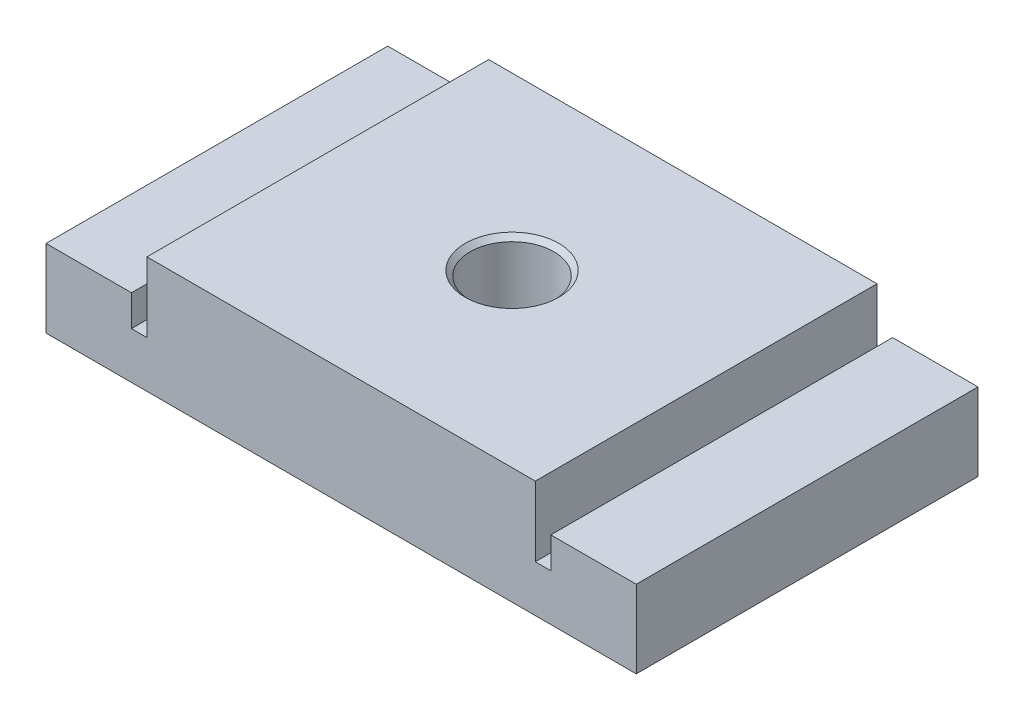
ISO-10303-21;
HEADER;
FILE_DESCRIPTION(('STEP AP214'),'2;1');
FILE_NAME('part.step','',(''),(''),'','','');
FILE_SCHEMA(('AUTOMOTIVE_DESIGN { 1 0 10303 214 1 1 1 1 }'));
ENDSEC;
DATA;
#1=APPLICATION_CONTEXT('core data for automotive mechanical design processes');
#2=APPLICATION_PROTOCOL_DEFINITION('international standard','automotive_design',2000,#1);
#3=PRODUCT_CONTEXT('',#1,'mechanical');
#4=PRODUCT('Part','Part','',(#3));
#5=PRODUCT_RELATED_PRODUCT_CATEGORY('part','',(#4));
#6=PRODUCT_DEFINITION_FORMATION('','',#4);
#7=PRODUCT_DEFINITION_CONTEXT('part definition',#1,'design');
#8=PRODUCT_DEFINITION('design','',#6,#7);
#9=PRODUCT_DEFINITION_SHAPE('','',#8);
#10=(LENGTH_UNIT() NAMED_UNIT(*) SI_UNIT(.MILLI.,.METRE.));
#11=(NAMED_UNIT(*) PLANE_ANGLE_UNIT() SI_UNIT($,.RADIAN.));
#12=(NAMED_UNIT(*) SI_UNIT($,.STERADIAN.) SOLID_ANGLE_UNIT());
#13=UNCERTAINTY_MEASURE_WITH_UNIT(LENGTH_MEASURE(1.E-05),#10,'distance_accuracy_value','');
#14=(GEOMETRIC_REPRESENTATION_CONTEXT(3) GLOBAL_UNCERTAINTY_ASSIGNED_CONTEXT((#13)) GLOBAL_UNIT_ASSIGNED_CONTEXT((#10,
#11,#12)) REPRESENTATION_CONTEXT('',''));
#15=CARTESIAN_POINT('',(0.,0.,0.));
#16=DIRECTION('',(0.,0.,1.));
#17=DIRECTION('',(1.,0.,0.));
#18=AXIS2_PLACEMENT_3D('',#15,#16,#17);
#19=CARTESIAN_POINT('',(-25.,15.,22.));
#20=DIRECTION('',(0.,-1.,0.));
#21=DIRECTION('',(0.,0.,-1.));
#22=AXIS2_PLACEMENT_3D('',#19,#20,#21);
#23=PLANE('',#22);
#24=DIRECTION('',(-1.,0.,0.));
#25=VECTOR('',#24,1.);
#26=CARTESIAN_POINT('',(-25.,15.,-22.));
#27=LINE('',#26,#25);
#28=CARTESIAN_POINT('',(25.,15.,-22.));
#29=VERTEX_POINT('',#28);
#30=CARTESIAN_POINT('',(-25.,15.,-22.));
#31=VERTEX_POINT('',#30);
#32=EDGE_CURVE('E195',#29,#31,#27,.T.);
#33=ORIENTED_EDGE('',*,*,#32,.T.);
#34=DIRECTION('',(0.,0.,-1.));
#35=VECTOR('',#34,1.);
#36=CARTESIAN_POINT('',(-25.,15.,22.));
#37=LINE('',#36,#35);
#38=CARTESIAN_POINT('',(-25.,15.,22.));
#39=VERTEX_POINT('',#38);
#40=EDGE_CURVE('E221',#39,#31,#37,.T.);
#41=ORIENTED_EDGE('',*,*,#40,.F.);
#42=DIRECTION('',(-1.,0.,0.));
#43=VECTOR('',#42,1.);
#44=CARTESIAN_POINT('',(-25.,15.,22.));
#45=LINE('',#44,#43);
#46=CARTESIAN_POINT('',(25.,15.,22.));
#47=VERTEX_POINT('',#46);
#48=EDGE_CURVE('E270',#47,#39,#45,.T.);
#49=ORIENTED_EDGE('',*,*,#48,.F.);
#50=DIRECTION('',(0.,0.,-1.));
#51=VECTOR('',#50,1.);
#52=CARTESIAN_POINT('',(25.,15.,22.));
#53=LINE('',#52,#51);
#54=EDGE_CURVE('E225',#47,#29,#53,.T.);
#55=ORIENTED_EDGE('',*,*,#54,.T.);
#56=EDGE_LOOP('',(#33,#41,#49,#55));
#57=FACE_BOUND('',#56,.T.);
#58=CARTESIAN_POINT('',(0.,15.,0.));
#59=DIRECTION('',(0.,1.,0.));
#60=DIRECTION('',(0.,0.,1.));
#61=AXIS2_PLACEMENT_3D('',#58,#59,#60);
#62=CIRCLE('',#61,6.025);
#63=CARTESIAN_POINT('',(0.,15.,6.025));
#64=VERTEX_POINT('',#63);
#65=EDGE_CURVE('E429',#64,#64,#62,.T.);
#66=ORIENTED_EDGE('',*,*,#65,.F.);
#67=EDGE_LOOP('',(#66));
#68=FACE_BOUND('',#67,.T.);
#69=ADVANCED_FACE('F49',(#57,#68),#23,.F.);
#70=CARTESIAN_POINT('',(-38.,0.,22.));
#71=DIRECTION('',(0.,1.,0.));
#72=DIRECTION('',(0.,0.,1.));
#73=AXIS2_PLACEMENT_3D('',#70,#71,#72);
#74=PLANE('',#73);
#75=CARTESIAN_POINT('',(0.,0.,0.));
#76=DIRECTION('',(0.,1.,0.));
#77=DIRECTION('',(0.,0.,1.));
#78=AXIS2_PLACEMENT_3D('',#75,#76,#77);
#79=CIRCLE('',#78,5.39999999999999);
#80=CARTESIAN_POINT('',(0.,0.,5.39999999999999));
#81=VERTEX_POINT('',#80);
#82=EDGE_CURVE('E180',#81,#81,#79,.T.);
#83=ORIENTED_EDGE('',*,*,#82,.T.);
#84=EDGE_LOOP('',(#83));
#85=FACE_BOUND('',#84,.T.);
#86=DIRECTION('',(1.,0.,0.));
#87=VECTOR('',#86,1.);
#88=CARTESIAN_POINT('',(-38.,0.,-22.));
#89=LINE('',#88,#87);
#90=CARTESIAN_POINT('',(-38.,0.,-22.));
#91=VERTEX_POINT('',#90);
#92=CARTESIAN_POINT('',(38.,0.,-22.));
#93=VERTEX_POINT('',#92);
#94=EDGE_CURVE('E175',#91,#93,#89,.T.);
#95=ORIENTED_EDGE('',*,*,#94,.T.);
#96=DIRECTION('',(0.,0.,-1.));
#97=VECTOR('',#96,1.);
#98=CARTESIAN_POINT('',(38.,0.,22.));
#99=LINE('',#98,#97);
#100=CARTESIAN_POINT('',(38.,0.,22.));
#101=VERTEX_POINT('',#100);
#102=EDGE_CURVE('E11',#101,#93,#99,.T.);
#103=ORIENTED_EDGE('',*,*,#102,.F.);
#104=DIRECTION('',(1.,0.,0.));
#105=VECTOR('',#104,1.);
#106=CARTESIAN_POINT('',(-38.,0.,22.));
#107=LINE('',#106,#105);
#108=CARTESIAN_POINT('',(-38.,0.,22.));
#109=VERTEX_POINT('',#108);
#110=EDGE_CURVE('E210',#109,#101,#107,.T.);
#111=ORIENTED_EDGE('',*,*,#110,.F.);
#112=DIRECTION('',(0.,0.,-1.));
#113=VECTOR('',#112,1.);
#114=CARTESIAN_POINT('',(-38.,0.,22.));
#115=LINE('',#114,#113);
#116=EDGE_CURVE('E171',#109,#91,#115,.T.);
#117=ORIENTED_EDGE('',*,*,#116,.T.);
#118=EDGE_LOOP('',(#95,#103,#111,#117));
#119=FACE_BOUND('',#118,.T.);
#120=ADVANCED_FACE('F51',(#85,#119),#74,.F.);
#121=CARTESIAN_POINT('',(38.,0.,22.));
#122=DIRECTION('',(-1.,0.,0.));
#123=DIRECTION('',(0.,0.,1.));
#124=AXIS2_PLACEMENT_3D('',#121,#122,#123);
#125=PLANE('',#124);
#126=DIRECTION('',(0.,1.,0.));
#127=VECTOR('',#126,1.);
#128=CARTESIAN_POINT('',(38.,0.,-22.));
#129=LINE('',#128,#127);
#130=CARTESIAN_POINT('',(38.,10.,-22.));
#131=VERTEX_POINT('',#130);
#132=EDGE_CURVE('E179',#93,#131,#129,.T.);
#133=ORIENTED_EDGE('',*,*,#132,.T.);
#134=DIRECTION('',(0.,0.,-1.));
#135=VECTOR('',#134,1.);
#136=CARTESIAN_POINT('',(38.,10.,22.));
#137=LINE('',#136,#135);
#138=CARTESIAN_POINT('',(38.,10.,22.));
#139=VERTEX_POINT('',#138);
#140=EDGE_CURVE('E59',#139,#131,#137,.T.);
#141=ORIENTED_EDGE('',*,*,#140,.F.);
#142=DIRECTION('',(0.,1.,0.));
#143=VECTOR('',#142,1.);
#144=CARTESIAN_POINT('',(38.,0.,22.));
#145=LINE('',#144,#143);
#146=EDGE_CURVE('E122',#101,#139,#145,.T.);
#147=ORIENTED_EDGE('',*,*,#146,.F.);
#148=ORIENTED_EDGE('',*,*,#102,.T.);
#149=EDGE_LOOP('',(#133,#141,#147,#148));
#150=FACE_BOUND('',#149,.T.);
#151=ADVANCED_FACE('F310',(#150),#125,.F.);
#152=CARTESIAN_POINT('',(38.,10.,22.));
#153=DIRECTION('',(0.,-1.,0.));
#154=DIRECTION('',(0.,0.,-1.));
#155=AXIS2_PLACEMENT_3D('',#152,#153,#154);
#156=PLANE('',#155);
#157=DIRECTION('',(-1.,0.,0.));
#158=VECTOR('',#157,1.);
#159=CARTESIAN_POINT('',(38.,10.,-22.));
#160=LINE('',#159,#158);
#161=CARTESIAN_POINT('',(27.,10.,-22.));
#162=VERTEX_POINT('',#161);
#163=EDGE_CURVE('E183',#131,#162,#160,.T.);
#164=ORIENTED_EDGE('',*,*,#163,.T.);
#165=DIRECTION('',(0.,0.,-1.));
#166=VECTOR('',#165,1.);
#167=CARTESIAN_POINT('',(27.,10.,22.));
#168=LINE('',#167,#166);
#169=CARTESIAN_POINT('',(27.,10.,22.));
#170=VERTEX_POINT('',#169);
#171=EDGE_CURVE('E237',#170,#162,#168,.T.);
#172=ORIENTED_EDGE('',*,*,#171,.F.);
#173=DIRECTION('',(-1.,0.,0.));
#174=VECTOR('',#173,1.);
#175=CARTESIAN_POINT('',(38.,10.,22.));
#176=LINE('',#175,#174);
#177=EDGE_CURVE('E247',#139,#170,#176,.T.);
#178=ORIENTED_EDGE('',*,*,#177,.F.);
#179=ORIENTED_EDGE('',*,*,#140,.T.);
#180=EDGE_LOOP('',(#164,#172,#178,#179));
#181=FACE_BOUND('',#180,.T.);
#182=ADVANCED_FACE('F245',(#181),#156,.F.);
#183=CARTESIAN_POINT('',(27.,10.,22.));
#184=DIRECTION('',(1.,0.,0.));
#185=DIRECTION('',(0.,0.,-1.));
#186=AXIS2_PLACEMENT_3D('',#183,#184,#185);
#187=PLANE('',#186);
#188=DIRECTION('',(0.,-1.,0.));
#189=VECTOR('',#188,1.);
#190=CARTESIAN_POINT('',(27.,10.,-22.));
#191=LINE('',#190,#189);
#192=CARTESIAN_POINT('',(27.,6.,-22.));
#193=VERTEX_POINT('',#192);
#194=EDGE_CURVE('E186',#162,#193,#191,.T.);
#195=ORIENTED_EDGE('',*,*,#194,.T.);
#196=DIRECTION('',(0.,0.,-1.));
#197=VECTOR('',#196,1.);
#198=CARTESIAN_POINT('',(27.,6.,22.));
#199=LINE('',#198,#197);
#200=CARTESIAN_POINT('',(27.,6.,22.));
#201=VERTEX_POINT('',#200);
#202=EDGE_CURVE('E233',#201,#193,#199,.T.);
#203=ORIENTED_EDGE('',*,*,#202,.F.);
#204=DIRECTION('',(0.,-1.,0.));
#205=VECTOR('',#204,1.);
#206=CARTESIAN_POINT('',(27.,10.,22.));
#207=LINE('',#206,#205);
#208=EDGE_CURVE('E266',#170,#201,#207,.T.);
#209=ORIENTED_EDGE('',*,*,#208,.F.);
#210=ORIENTED_EDGE('',*,*,#171,.T.);
#211=EDGE_LOOP('',(#195,#203,#209,#210));
#212=FACE_BOUND('',#211,.T.);
#213=ADVANCED_FACE('F256',(#212),#187,.F.);
#214=CARTESIAN_POINT('',(27.,6.,22.));
#215=DIRECTION('',(0.,-1.,0.));
#216=DIRECTION('',(0.,0.,-1.));
#217=AXIS2_PLACEMENT_3D('',#214,#215,#216);
#218=PLANE('',#217);
#219=DIRECTION('',(-1.,0.,0.));
#220=VECTOR('',#219,1.);
#221=CARTESIAN_POINT('',(27.,6.,-22.));
#222=LINE('',#221,#220);
#223=CARTESIAN_POINT('',(25.,6.,-22.));
#224=VERTEX_POINT('',#223);
#225=EDGE_CURVE('E189',#193,#224,#222,.T.);
#226=ORIENTED_EDGE('',*,*,#225,.T.);
#227=DIRECTION('',(0.,0.,-1.));
#228=VECTOR('',#227,1.);
#229=CARTESIAN_POINT('',(25.,6.,22.));
#230=LINE('',#229,#228);
#231=CARTESIAN_POINT('',(25.,6.,22.));
#232=VERTEX_POINT('',#231);
#233=EDGE_CURVE('E229',#232,#224,#230,.T.);
#234=ORIENTED_EDGE('',*,*,#233,.F.);
#235=DIRECTION('',(-1.,0.,0.));
#236=VECTOR('',#235,1.);
#237=CARTESIAN_POINT('',(27.,6.,22.));
#238=LINE('',#237,#236);
#239=EDGE_CURVE('E262',#201,#232,#238,.T.);
#240=ORIENTED_EDGE('',*,*,#239,.F.);
#241=ORIENTED_EDGE('',*,*,#202,.T.);
#242=EDGE_LOOP('',(#226,#234,#240,#241));
#243=FACE_BOUND('',#242,.T.);
#244=ADVANCED_FACE('F260',(#243),#218,.F.);
#245=CARTESIAN_POINT('',(25.,6.,22.));
#246=DIRECTION('',(-1.,0.,0.));
#247=DIRECTION('',(0.,0.,1.));
#248=AXIS2_PLACEMENT_3D('',#245,#246,#247);
#249=PLANE('',#248);
#250=DIRECTION('',(0.,1.,0.));
#251=VECTOR('',#250,1.);
#252=CARTESIAN_POINT('',(25.,6.,-22.));
#253=LINE('',#252,#251);
#254=EDGE_CURVE('E192',#224,#29,#253,.T.);
#255=ORIENTED_EDGE('',*,*,#254,.T.);
#256=ORIENTED_EDGE('',*,*,#54,.F.);
#257=DIRECTION('',(0.,1.,0.));
#258=VECTOR('',#257,1.);
#259=CARTESIAN_POINT('',(25.,6.,22.));
#260=LINE('',#259,#258);
#261=EDGE_CURVE('E265',#232,#47,#260,.T.);
#262=ORIENTED_EDGE('',*,*,#261,.F.);
#263=ORIENTED_EDGE('',*,*,#233,.T.);
#264=EDGE_LOOP('',(#255,#256,#262,#263));
#265=FACE_BOUND('',#264,.T.);
#266=ADVANCED_FACE('F316',(#265),#249,.F.);
#267=CARTESIAN_POINT('',(-25.,6.,22.));
#268=DIRECTION('',(1.,0.,0.));
#269=DIRECTION('',(0.,0.,-1.));
#270=AXIS2_PLACEMENT_3D('',#267,#268,#269);
#271=PLANE('',#270);
#272=DIRECTION('',(0.,-1.,0.));
#273=VECTOR('',#272,1.);
#274=CARTESIAN_POINT('',(-25.,6.,-22.));
#275=LINE('',#274,#273);
#276=CARTESIAN_POINT('',(-25.,6.,-22.));
#277=VERTEX_POINT('',#276);
#278=EDGE_CURVE('E198',#31,#277,#275,.T.);
#279=ORIENTED_EDGE('',*,*,#278,.T.);
#280=DIRECTION('',(0.,0.,-1.));
#281=VECTOR('',#280,1.);
#282=CARTESIAN_POINT('',(-25.,6.,22.));
#283=LINE('',#282,#281);
#284=CARTESIAN_POINT('',(-25.,6.,22.));
#285=VERTEX_POINT('',#284);
#286=EDGE_CURVE('E217',#285,#277,#283,.T.);
#287=ORIENTED_EDGE('',*,*,#286,.F.);
#288=DIRECTION('',(0.,-1.,0.));
#289=VECTOR('',#288,1.);
#290=CARTESIAN_POINT('',(-25.,6.,22.));
#291=LINE('',#290,#289);
#292=EDGE_CURVE('E277',#39,#285,#291,.T.);
#293=ORIENTED_EDGE('',*,*,#292,.F.);
#294=ORIENTED_EDGE('',*,*,#40,.T.);
#295=EDGE_LOOP('',(#279,#287,#293,#294));
#296=FACE_BOUND('',#295,.T.);
#297=ADVANCED_FACE('F285',(#296),#271,.F.);
#298=CARTESIAN_POINT('',(-27.,6.,22.));
#299=DIRECTION('',(0.,-1.,0.));
#300=DIRECTION('',(0.,0.,-1.));
#301=AXIS2_PLACEMENT_3D('',#298,#299,#300);
#302=PLANE('',#301);
#303=DIRECTION('',(-1.,0.,0.));
#304=VECTOR('',#303,1.);
#305=CARTESIAN_POINT('',(-27.,6.,-22.));
#306=LINE('',#305,#304);
#307=CARTESIAN_POINT('',(-27.,6.,-22.));
#308=VERTEX_POINT('',#307);
#309=EDGE_CURVE('E201',#277,#308,#306,.T.);
#310=ORIENTED_EDGE('',*,*,#309,.T.);
#311=DIRECTION('',(0.,0.,-1.));
#312=VECTOR('',#311,1.);
#313=CARTESIAN_POINT('',(-27.,6.,22.));
#314=LINE('',#313,#312);
#315=CARTESIAN_POINT('',(-27.,6.,22.));
#316=VERTEX_POINT('',#315);
#317=EDGE_CURVE('E164',#316,#308,#314,.T.);
#318=ORIENTED_EDGE('',*,*,#317,.F.);
#319=DIRECTION('',(-1.,0.,0.));
#320=VECTOR('',#319,1.);
#321=CARTESIAN_POINT('',(-27.,6.,22.));
#322=LINE('',#321,#320);
#323=EDGE_CURVE('E153',#285,#316,#322,.T.);
#324=ORIENTED_EDGE('',*,*,#323,.F.);
#325=ORIENTED_EDGE('',*,*,#286,.T.);
#326=EDGE_LOOP('',(#310,#318,#324,#325));
#327=FACE_BOUND('',#326,.T.);
#328=ADVANCED_FACE('F289',(#327),#302,.F.);
#329=CARTESIAN_POINT('',(-27.,10.,22.));
#330=DIRECTION('',(-1.,0.,0.));
#331=DIRECTION('',(0.,0.,1.));
#332=AXIS2_PLACEMENT_3D('',#329,#330,#331);
#333=PLANE('',#332);
#334=DIRECTION('',(0.,1.,0.));
#335=VECTOR('',#334,1.);
#336=CARTESIAN_POINT('',(-27.,10.,-22.));
#337=LINE('',#336,#335);
#338=CARTESIAN_POINT('',(-27.,10.,-22.));
#339=VERTEX_POINT('',#338);
#340=EDGE_CURVE('E162',#308,#339,#337,.T.);
#341=ORIENTED_EDGE('',*,*,#340,.T.);
#342=DIRECTION('',(0.,0.,-1.));
#343=VECTOR('',#342,1.);
#344=CARTESIAN_POINT('',(-27.,10.,22.));
#345=LINE('',#344,#343);
#346=CARTESIAN_POINT('',(-27.,10.,22.));
#347=VERTEX_POINT('',#346);
#348=EDGE_CURVE('E159',#347,#339,#345,.T.);
#349=ORIENTED_EDGE('',*,*,#348,.F.);
#350=DIRECTION('',(0.,1.,0.));
#351=VECTOR('',#350,1.);
#352=CARTESIAN_POINT('',(-27.,10.,22.));
#353=LINE('',#352,#351);
#354=EDGE_CURVE('E147',#316,#347,#353,.T.);
#355=ORIENTED_EDGE('',*,*,#354,.F.);
#356=ORIENTED_EDGE('',*,*,#317,.T.);
#357=EDGE_LOOP('',(#341,#349,#355,#356));
#358=FACE_BOUND('',#357,.T.);
#359=ADVANCED_FACE('F160',(#358),#333,.F.);
#360=CARTESIAN_POINT('',(-38.,10.,22.));
#361=DIRECTION('',(0.,-1.,0.));
#362=DIRECTION('',(0.,0.,-1.));
#363=AXIS2_PLACEMENT_3D('',#360,#361,#362);
#364=PLANE('',#363);
#365=DIRECTION('',(-1.,0.,0.));
#366=VECTOR('',#365,1.);
#367=CARTESIAN_POINT('',(-38.,10.,-22.));
#368=LINE('',#367,#366);
#369=CARTESIAN_POINT('',(-38.,10.,-22.));
#370=VERTEX_POINT('',#369);
#371=EDGE_CURVE('E108',#339,#370,#368,.T.);
#372=ORIENTED_EDGE('',*,*,#371,.T.);
#373=DIRECTION('',(0.,0.,-1.));
#374=VECTOR('',#373,1.);
#375=CARTESIAN_POINT('',(-38.,10.,22.));
#376=LINE('',#375,#374);
#377=CARTESIAN_POINT('',(-38.,10.,22.));
#378=VERTEX_POINT('',#377);
#379=EDGE_CURVE('E165',#378,#370,#376,.T.);
#380=ORIENTED_EDGE('',*,*,#379,.F.);
#381=DIRECTION('',(-1.,0.,0.));
#382=VECTOR('',#381,1.);
#383=CARTESIAN_POINT('',(-38.,10.,22.));
#384=LINE('',#383,#382);
#385=EDGE_CURVE('E151',#347,#378,#384,.T.);
#386=ORIENTED_EDGE('',*,*,#385,.F.);
#387=ORIENTED_EDGE('',*,*,#348,.T.);
#388=EDGE_LOOP('',(#372,#380,#386,#387));
#389=FACE_BOUND('',#388,.T.);
#390=ADVANCED_FACE('F167',(#389),#364,.F.);
#391=CARTESIAN_POINT('',(-38.,0.,22.));
#392=DIRECTION('',(1.,0.,0.));
#393=DIRECTION('',(0.,0.,-1.));
#394=AXIS2_PLACEMENT_3D('',#391,#392,#393);
#395=PLANE('',#394);
#396=DIRECTION('',(0.,-1.,0.));
#397=VECTOR('',#396,1.);
#398=CARTESIAN_POINT('',(-38.,0.,-22.));
#399=LINE('',#398,#397);
#400=EDGE_CURVE('E114',#370,#91,#399,.T.);
#401=ORIENTED_EDGE('',*,*,#400,.T.);
#402=ORIENTED_EDGE('',*,*,#116,.F.);
#403=DIRECTION('',(0.,-1.,0.));
#404=VECTOR('',#403,1.);
#405=CARTESIAN_POINT('',(-38.,0.,22.));
#406=LINE('',#405,#404);
#407=EDGE_CURVE('E67',#378,#109,#406,.T.);
#408=ORIENTED_EDGE('',*,*,#407,.F.);
#409=ORIENTED_EDGE('',*,*,#379,.T.);
#410=EDGE_LOOP('',(#401,#402,#408,#409));
#411=FACE_BOUND('',#410,.T.);
#412=ADVANCED_FACE('F293',(#411),#395,.F.);
#413=CARTESIAN_POINT('',(0.,0.,22.));
#414=DIRECTION('',(0.,0.,1.));
#415=DIRECTION('',(1.,0.,0.));
#416=AXIS2_PLACEMENT_3D('',#413,#414,#415);
#417=PLANE('',#416);
#418=ORIENTED_EDGE('',*,*,#110,.T.);
#419=ORIENTED_EDGE('',*,*,#146,.T.);
#420=ORIENTED_EDGE('',*,*,#177,.T.);
#421=ORIENTED_EDGE('',*,*,#208,.T.);
#422=ORIENTED_EDGE('',*,*,#239,.T.);
#423=ORIENTED_EDGE('',*,*,#261,.T.);
#424=ORIENTED_EDGE('',*,*,#48,.T.);
#425=ORIENTED_EDGE('',*,*,#292,.T.);
#426=ORIENTED_EDGE('',*,*,#323,.T.);
#427=ORIENTED_EDGE('',*,*,#354,.T.);
#428=ORIENTED_EDGE('',*,*,#385,.T.);
#429=ORIENTED_EDGE('',*,*,#407,.T.);
#430=EDGE_LOOP('',(#418,#419,#420,#421,#422,#423,#424,#425,#426,#427,#428,#429));
#431=FACE_BOUND('',#430,.T.);
#432=ADVANCED_FACE('F149',(#431),#417,.T.);
#433=CARTESIAN_POINT('',(0.,0.,-22.));
#434=DIRECTION('',(0.,0.,1.));
#435=DIRECTION('',(1.,0.,0.));
#436=AXIS2_PLACEMENT_3D('',#433,#434,#435);
#437=PLANE('',#436);
#438=ORIENTED_EDGE('',*,*,#94,.F.);
#439=ORIENTED_EDGE('',*,*,#400,.F.);
#440=ORIENTED_EDGE('',*,*,#371,.F.);
#441=ORIENTED_EDGE('',*,*,#340,.F.);
#442=ORIENTED_EDGE('',*,*,#309,.F.);
#443=ORIENTED_EDGE('',*,*,#278,.F.);
#444=ORIENTED_EDGE('',*,*,#32,.F.);
#445=ORIENTED_EDGE('',*,*,#254,.F.);
#446=ORIENTED_EDGE('',*,*,#225,.F.);
#447=ORIENTED_EDGE('',*,*,#194,.F.);
#448=ORIENTED_EDGE('',*,*,#163,.F.);
#449=ORIENTED_EDGE('',*,*,#132,.F.);
#450=EDGE_LOOP('',(#438,#439,#440,#441,#442,#443,#444,#445,#446,#447,#448,#449));
#451=FACE_BOUND('',#450,.T.);
#452=ADVANCED_FACE('F251',(#451),#437,.F.);
#453=CARTESIAN_POINT('',(0.,15.,0.));
#454=DIRECTION('',(0.,1.,0.));
#455=DIRECTION('',(0.,0.,1.));
#456=AXIS2_PLACEMENT_3D('',#453,#454,#455);
#457=CYLINDRICAL_SURFACE('',#456,5.39999999999999);
#458=ORIENTED_EDGE('',*,*,#82,.F.);
#459=EDGE_LOOP('',(#458));
#460=FACE_BOUND('',#459,.T.);
#461=CARTESIAN_POINT('',(0.,14.375,0.));
#462=DIRECTION('',(0.,1.,0.));
#463=DIRECTION('',(0.,0.,1.));
#464=AXIS2_PLACEMENT_3D('',#461,#462,#463);
#465=CIRCLE('',#464,5.39999999999999);
#466=CARTESIAN_POINT('',(0.,14.375,5.39999999999999));
#467=VERTEX_POINT('',#466);
#468=EDGE_CURVE('E426',#467,#467,#465,.T.);
#469=ORIENTED_EDGE('',*,*,#468,.T.);
#470=EDGE_LOOP('',(#469));
#471=FACE_BOUND('',#470,.T.);
#472=ADVANCED_FACE('F392',(#460,#471),#457,.F.);
#473=CARTESIAN_POINT('',(0.,15.,0.));
#474=DIRECTION('',(0.,1.,0.));
#475=DIRECTION('',(0.,0.,1.));
#476=AXIS2_PLACEMENT_3D('',#473,#474,#475);
#477=CONICAL_SURFACE('',#476,6.025,0.785398163397447);
#478=ORIENTED_EDGE('',*,*,#468,.F.);
#479=EDGE_LOOP('',(#478));
#480=FACE_BOUND('',#479,.T.);
#481=ORIENTED_EDGE('',*,*,#65,.T.);
#482=EDGE_LOOP('',(#481));
#483=FACE_BOUND('',#482,.T.);
#484=ADVANCED_FACE('F405',(#480,#483),#477,.F.);
#485=CLOSED_SHELL('',(#69,#120,#151,#182,#213,#244,#266,#297,#328,#359,#390,#412,#432,#452,#472,#484));
#486=MANIFOLD_SOLID_BREP('B2',#485);
#487=ADVANCED_BREP_SHAPE_REPRESENTATION('',(#18,#486),#14);
#488=SHAPE_DEFINITION_REPRESENTATION(#9,#487);
ENDSEC;
END-ISO-10303-21;
